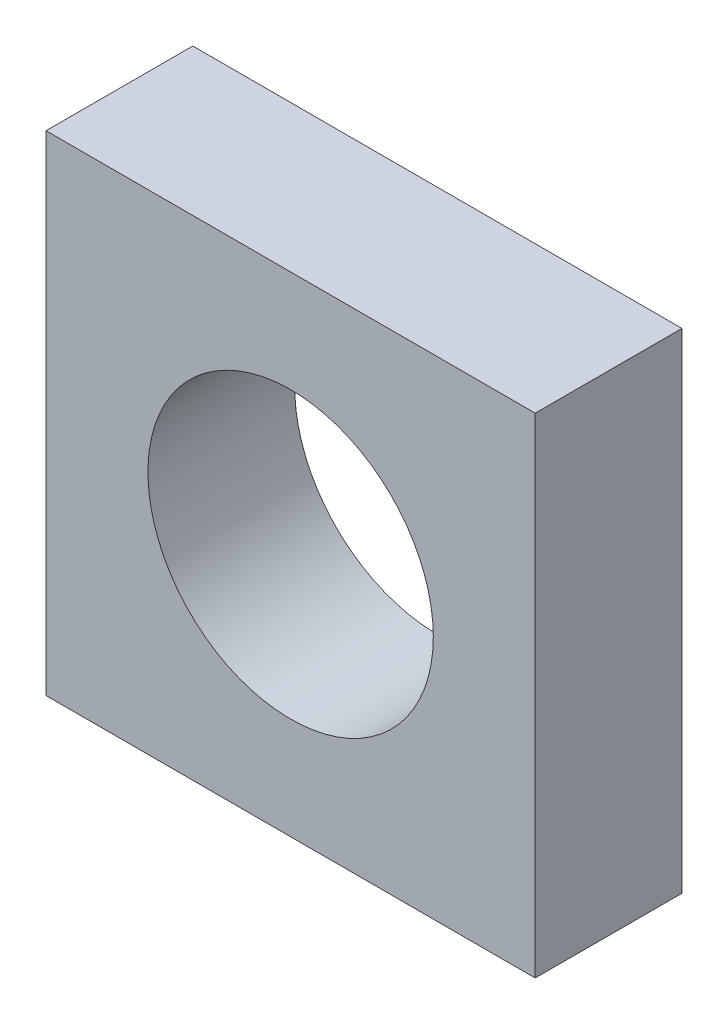
ISO-10303-21;
HEADER;
FILE_DESCRIPTION(('STEP AP214'),'2;1');
FILE_NAME('part.step','',(''),(''),'','','');
FILE_SCHEMA(('AUTOMOTIVE_DESIGN { 1 0 10303 214 1 1 1 1 }'));
ENDSEC;
DATA;
#1=APPLICATION_CONTEXT('core data for automotive mechanical design processes');
#2=APPLICATION_PROTOCOL_DEFINITION('international standard','automotive_design',2000,#1);
#3=PRODUCT_CONTEXT('',#1,'mechanical');
#4=PRODUCT('Part','Part','',(#3));
#5=PRODUCT_RELATED_PRODUCT_CATEGORY('part','',(#4));
#6=PRODUCT_DEFINITION_FORMATION('','',#4);
#7=PRODUCT_DEFINITION_CONTEXT('part definition',#1,'design');
#8=PRODUCT_DEFINITION('design','',#6,#7);
#9=PRODUCT_DEFINITION_SHAPE('','',#8);
#10=(LENGTH_UNIT() NAMED_UNIT(*) SI_UNIT(.MILLI.,.METRE.));
#11=(NAMED_UNIT(*) PLANE_ANGLE_UNIT() SI_UNIT($,.RADIAN.));
#12=(NAMED_UNIT(*) SI_UNIT($,.STERADIAN.) SOLID_ANGLE_UNIT());
#13=UNCERTAINTY_MEASURE_WITH_UNIT(LENGTH_MEASURE(1.E-05),#10,'distance_accuracy_value','');
#14=(GEOMETRIC_REPRESENTATION_CONTEXT(3) GLOBAL_UNCERTAINTY_ASSIGNED_CONTEXT((#13)) GLOBAL_UNIT_ASSIGNED_CONTEXT((#10,
#11,#12)) REPRESENTATION_CONTEXT('',''));
#15=CARTESIAN_POINT('',(0.,0.,0.));
#16=DIRECTION('',(0.,0.,1.));
#17=DIRECTION('',(1.,0.,0.));
#18=AXIS2_PLACEMENT_3D('',#15,#16,#17);
#19=CARTESIAN_POINT('',(0.,0.,0.9));
#20=DIRECTION('',(0.,0.,-1.));
#21=DIRECTION('',(-1.,0.,0.));
#22=AXIS2_PLACEMENT_3D('',#19,#20,#21);
#23=PLANE('',#22);
#24=DIRECTION('',(0.,1.,0.));
#25=VECTOR('',#24,1.);
#26=CARTESIAN_POINT('',(3.,-3.,0.9));
#27=LINE('',#26,#25);
#28=CARTESIAN_POINT('',(3.,-3.,0.9));
#29=VERTEX_POINT('',#28);
#30=CARTESIAN_POINT('',(3.,3.,0.9));
#31=VERTEX_POINT('',#30);
#32=EDGE_CURVE('E88',#29,#31,#27,.T.);
#33=ORIENTED_EDGE('',*,*,#32,.T.);
#34=DIRECTION('',(-1.,0.,0.));
#35=VECTOR('',#34,1.);
#36=CARTESIAN_POINT('',(-3.,3.,0.9));
#37=LINE('',#36,#35);
#38=CARTESIAN_POINT('',(-3.,3.,0.9));
#39=VERTEX_POINT('',#38);
#40=EDGE_CURVE('E83',#31,#39,#37,.T.);
#41=ORIENTED_EDGE('',*,*,#40,.T.);
#42=DIRECTION('',(0.,-1.,0.));
#43=VECTOR('',#42,1.);
#44=CARTESIAN_POINT('',(-3.,-3.,0.9));
#45=LINE('',#44,#43);
#46=CARTESIAN_POINT('',(-3.,-3.,0.9));
#47=VERTEX_POINT('',#46);
#48=EDGE_CURVE('E86',#39,#47,#45,.T.);
#49=ORIENTED_EDGE('',*,*,#48,.T.);
#50=DIRECTION('',(1.,0.,0.));
#51=VECTOR('',#50,1.);
#52=CARTESIAN_POINT('',(-3.,-3.,0.9));
#53=LINE('',#52,#51);
#54=EDGE_CURVE('E53',#47,#29,#53,.T.);
#55=ORIENTED_EDGE('',*,*,#54,.T.);
#56=EDGE_LOOP('',(#33,#41,#49,#55));
#57=FACE_BOUND('',#56,.T.);
#58=CARTESIAN_POINT('',(0.,0.,0.9));
#59=DIRECTION('',(0.,0.,1.));
#60=DIRECTION('',(1.,0.,0.));
#61=AXIS2_PLACEMENT_3D('',#58,#59,#60);
#62=CIRCLE('',#61,1.75);
#63=CARTESIAN_POINT('',(1.75,0.,0.9));
#64=VERTEX_POINT('',#63);
#65=EDGE_CURVE('E103',#64,#64,#62,.T.);
#66=ORIENTED_EDGE('',*,*,#65,.F.);
#67=EDGE_LOOP('',(#66));
#68=FACE_BOUND('',#67,.T.);
#69=ADVANCED_FACE('F36',(#57,#68),#23,.F.);
#70=CARTESIAN_POINT('',(0.,0.,-0.9));
#71=DIRECTION('',(0.,0.,-1.));
#72=DIRECTION('',(-1.,0.,0.));
#73=AXIS2_PLACEMENT_3D('',#70,#71,#72);
#74=PLANE('',#73);
#75=DIRECTION('',(0.,1.,0.));
#76=VECTOR('',#75,1.);
#77=CARTESIAN_POINT('',(3.,-3.,-0.9));
#78=LINE('',#77,#76);
#79=CARTESIAN_POINT('',(3.,-3.,-0.9));
#80=VERTEX_POINT('',#79);
#81=CARTESIAN_POINT('',(3.,3.,-0.9));
#82=VERTEX_POINT('',#81);
#83=EDGE_CURVE('E100',#80,#82,#78,.T.);
#84=ORIENTED_EDGE('',*,*,#83,.F.);
#85=DIRECTION('',(1.,0.,0.));
#86=VECTOR('',#85,1.);
#87=CARTESIAN_POINT('',(-3.,-3.,-0.9));
#88=LINE('',#87,#86);
#89=CARTESIAN_POINT('',(-3.,-3.,-0.9));
#90=VERTEX_POINT('',#89);
#91=EDGE_CURVE('E76',#90,#80,#88,.T.);
#92=ORIENTED_EDGE('',*,*,#91,.F.);
#93=DIRECTION('',(0.,-1.,0.));
#94=VECTOR('',#93,1.);
#95=CARTESIAN_POINT('',(-3.,-3.,-0.9));
#96=LINE('',#95,#94);
#97=CARTESIAN_POINT('',(-3.,3.,-0.9));
#98=VERTEX_POINT('',#97);
#99=EDGE_CURVE('E70',#98,#90,#96,.T.);
#100=ORIENTED_EDGE('',*,*,#99,.F.);
#101=DIRECTION('',(-1.,0.,0.));
#102=VECTOR('',#101,1.);
#103=CARTESIAN_POINT('',(-3.,3.,-0.9));
#104=LINE('',#103,#102);
#105=EDGE_CURVE('E92',#82,#98,#104,.T.);
#106=ORIENTED_EDGE('',*,*,#105,.F.);
#107=EDGE_LOOP('',(#84,#92,#100,#106));
#108=FACE_BOUND('',#107,.T.);
#109=CARTESIAN_POINT('',(0.,0.,-0.9));
#110=DIRECTION('',(0.,0.,1.));
#111=DIRECTION('',(1.,0.,0.));
#112=AXIS2_PLACEMENT_3D('',#109,#110,#111);
#113=CIRCLE('',#112,1.75);
#114=CARTESIAN_POINT('',(1.75,0.,-0.9));
#115=VERTEX_POINT('',#114);
#116=EDGE_CURVE('E115',#115,#115,#113,.T.);
#117=ORIENTED_EDGE('',*,*,#116,.T.);
#118=EDGE_LOOP('',(#117));
#119=FACE_BOUND('',#118,.T.);
#120=ADVANCED_FACE('F111',(#108,#119),#74,.T.);
#121=CARTESIAN_POINT('',(3.,-3.,0.9));
#122=DIRECTION('',(-1.,0.,0.));
#123=DIRECTION('',(0.,0.,1.));
#124=AXIS2_PLACEMENT_3D('',#121,#122,#123);
#125=PLANE('',#124);
#126=ORIENTED_EDGE('',*,*,#83,.T.);
#127=DIRECTION('',(0.,0.,-1.));
#128=VECTOR('',#127,1.);
#129=CARTESIAN_POINT('',(3.,3.,0.9));
#130=LINE('',#129,#128);
#131=EDGE_CURVE('E11',#31,#82,#130,.T.);
#132=ORIENTED_EDGE('',*,*,#131,.F.);
#133=ORIENTED_EDGE('',*,*,#32,.F.);
#134=DIRECTION('',(0.,0.,-1.));
#135=VECTOR('',#134,1.);
#136=CARTESIAN_POINT('',(3.,-3.,0.9));
#137=LINE('',#136,#135);
#138=EDGE_CURVE('E96',#29,#80,#137,.T.);
#139=ORIENTED_EDGE('',*,*,#138,.T.);
#140=EDGE_LOOP('',(#126,#132,#133,#139));
#141=FACE_BOUND('',#140,.T.);
#142=ADVANCED_FACE('F38',(#141),#125,.F.);
#143=CARTESIAN_POINT('',(-3.,3.,0.9));
#144=DIRECTION('',(0.,-1.,0.));
#145=DIRECTION('',(0.,0.,-1.));
#146=AXIS2_PLACEMENT_3D('',#143,#144,#145);
#147=PLANE('',#146);
#148=ORIENTED_EDGE('',*,*,#105,.T.);
#149=DIRECTION('',(0.,0.,-1.));
#150=VECTOR('',#149,1.);
#151=CARTESIAN_POINT('',(-3.,3.,0.9));
#152=LINE('',#151,#150);
#153=EDGE_CURVE('E45',#39,#98,#152,.T.);
#154=ORIENTED_EDGE('',*,*,#153,.F.);
#155=ORIENTED_EDGE('',*,*,#40,.F.);
#156=ORIENTED_EDGE('',*,*,#131,.T.);
#157=EDGE_LOOP('',(#148,#154,#155,#156));
#158=FACE_BOUND('',#157,.T.);
#159=ADVANCED_FACE('F91',(#158),#147,.F.);
#160=CARTESIAN_POINT('',(-3.,-3.,0.9));
#161=DIRECTION('',(1.,0.,0.));
#162=DIRECTION('',(0.,0.,-1.));
#163=AXIS2_PLACEMENT_3D('',#160,#161,#162);
#164=PLANE('',#163);
#165=ORIENTED_EDGE('',*,*,#99,.T.);
#166=DIRECTION('',(0.,0.,-1.));
#167=VECTOR('',#166,1.);
#168=CARTESIAN_POINT('',(-3.,-3.,0.9));
#169=LINE('',#168,#167);
#170=EDGE_CURVE('E93',#47,#90,#169,.T.);
#171=ORIENTED_EDGE('',*,*,#170,.F.);
#172=ORIENTED_EDGE('',*,*,#48,.F.);
#173=ORIENTED_EDGE('',*,*,#153,.T.);
#174=EDGE_LOOP('',(#165,#171,#172,#173));
#175=FACE_BOUND('',#174,.T.);
#176=ADVANCED_FACE('F94',(#175),#164,.F.);
#177=CARTESIAN_POINT('',(-3.,-3.,0.9));
#178=DIRECTION('',(0.,1.,0.));
#179=DIRECTION('',(0.,0.,1.));
#180=AXIS2_PLACEMENT_3D('',#177,#178,#179);
#181=PLANE('',#180);
#182=ORIENTED_EDGE('',*,*,#91,.T.);
#183=ORIENTED_EDGE('',*,*,#138,.F.);
#184=ORIENTED_EDGE('',*,*,#54,.F.);
#185=ORIENTED_EDGE('',*,*,#170,.T.);
#186=EDGE_LOOP('',(#182,#183,#184,#185));
#187=FACE_BOUND('',#186,.T.);
#188=ADVANCED_FACE('F108',(#187),#181,.F.);
#189=CARTESIAN_POINT('',(0.,0.,0.9));
#190=DIRECTION('',(0.,0.,-1.));
#191=DIRECTION('',(-1.,0.,0.));
#192=AXIS2_PLACEMENT_3D('',#189,#190,#191);
#193=CYLINDRICAL_SURFACE('',#192,1.75);
#194=ORIENTED_EDGE('',*,*,#65,.T.);
#195=EDGE_LOOP('',(#194));
#196=FACE_BOUND('',#195,.T.);
#197=ORIENTED_EDGE('',*,*,#116,.F.);
#198=EDGE_LOOP('',(#197));
#199=FACE_BOUND('',#198,.T.);
#200=ADVANCED_FACE('F121',(#196,#199),#193,.F.);
#201=CLOSED_SHELL('',(#69,#120,#142,#159,#176,#188,#200));
#202=MANIFOLD_SOLID_BREP('B2',#201);
#203=ADVANCED_BREP_SHAPE_REPRESENTATION('',(#18,#202),#14);
#204=SHAPE_DEFINITION_REPRESENTATION(#9,#203);
ENDSEC;
END-ISO-10303-21;
